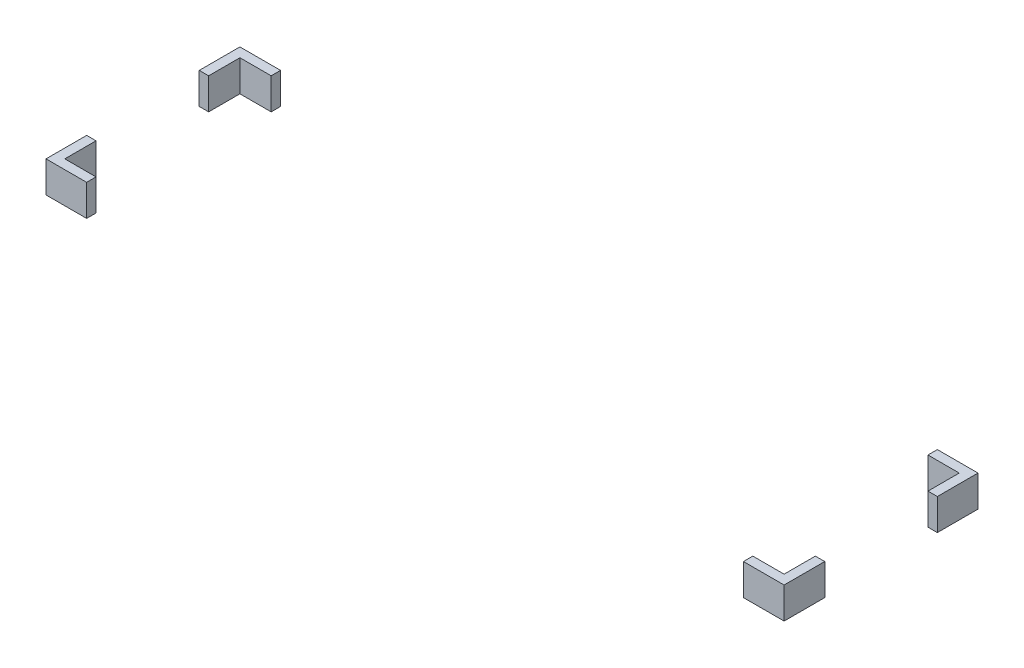
ISO-10303-21;
HEADER;
FILE_DESCRIPTION(('STEP AP214'),'2;1');
FILE_NAME('part.step','',(''),(''),'','','');
FILE_SCHEMA(('AUTOMOTIVE_DESIGN { 1 0 10303 214 1 1 1 1 }'));
ENDSEC;
DATA;
#1=APPLICATION_CONTEXT('core data for automotive mechanical design processes');
#2=APPLICATION_PROTOCOL_DEFINITION('international standard','automotive_design',2000,#1);
#3=PRODUCT_CONTEXT('',#1,'mechanical');
#4=PRODUCT('Part','Part','',(#3));
#5=PRODUCT_RELATED_PRODUCT_CATEGORY('part','',(#4));
#6=PRODUCT_DEFINITION_FORMATION('','',#4);
#7=PRODUCT_DEFINITION_CONTEXT('part definition',#1,'design');
#8=PRODUCT_DEFINITION('design','',#6,#7);
#9=PRODUCT_DEFINITION_SHAPE('','',#8);
#10=(LENGTH_UNIT() NAMED_UNIT(*) SI_UNIT(.MILLI.,.METRE.));
#11=(NAMED_UNIT(*) PLANE_ANGLE_UNIT() SI_UNIT($,.RADIAN.));
#12=(NAMED_UNIT(*) SI_UNIT($,.STERADIAN.) SOLID_ANGLE_UNIT());
#13=UNCERTAINTY_MEASURE_WITH_UNIT(LENGTH_MEASURE(1.E-05),#10,'distance_accuracy_value','');
#14=(GEOMETRIC_REPRESENTATION_CONTEXT(3) GLOBAL_UNCERTAINTY_ASSIGNED_CONTEXT((#13)) GLOBAL_UNIT_ASSIGNED_CONTEXT((#10,
#11,#12)) REPRESENTATION_CONTEXT('',''));
#15=CARTESIAN_POINT('',(0.,0.,0.));
#16=DIRECTION('',(0.,0.,1.));
#17=DIRECTION('',(1.,0.,0.));
#18=AXIS2_PLACEMENT_3D('',#15,#16,#17);
#19=CARTESIAN_POINT('',(0.,5.,14.));
#20=DIRECTION('',(0.,0.,1.));
#21=DIRECTION('',(1.,0.,0.));
#22=AXIS2_PLACEMENT_3D('',#19,#20,#21);
#23=PLANE('',#22);
#24=DIRECTION('',(-1.,0.,0.));
#25=VECTOR('',#24,1.);
#26=CARTESIAN_POINT('',(0.,0.,14.));
#27=LINE('',#26,#25);
#28=CARTESIAN_POINT('',(57.5,0.,14.));
#29=VERTEX_POINT('',#28);
#30=CARTESIAN_POINT('',(52.5,0.,14.));
#31=VERTEX_POINT('',#30);
#32=EDGE_CURVE('E128',#29,#31,#27,.T.);
#33=ORIENTED_EDGE('',*,*,#32,.T.);
#34=DIRECTION('',(0.,-1.,0.));
#35=VECTOR('',#34,1.);
#36=CARTESIAN_POINT('',(52.5,5.,14.));
#37=LINE('',#36,#35);
#38=CARTESIAN_POINT('',(52.5,5.,14.));
#39=VERTEX_POINT('',#38);
#40=EDGE_CURVE('E12',#39,#31,#37,.T.);
#41=ORIENTED_EDGE('',*,*,#40,.F.);
#42=DIRECTION('',(-1.,0.,0.));
#43=VECTOR('',#42,1.);
#44=CARTESIAN_POINT('',(0.,5.,14.));
#45=LINE('',#44,#43);
#46=CARTESIAN_POINT('',(57.5,5.,14.));
#47=VERTEX_POINT('',#46);
#48=EDGE_CURVE('E142',#47,#39,#45,.T.);
#49=ORIENTED_EDGE('',*,*,#48,.F.);
#50=DIRECTION('',(0.,-1.,0.));
#51=VECTOR('',#50,1.);
#52=CARTESIAN_POINT('',(57.5,5.,14.));
#53=LINE('',#52,#51);
#54=EDGE_CURVE('E60',#47,#29,#53,.T.);
#55=ORIENTED_EDGE('',*,*,#54,.T.);
#56=EDGE_LOOP('',(#33,#41,#49,#55));
#57=FACE_BOUND('',#56,.T.);
#58=ADVANCED_FACE('F44',(#57),#23,.F.);
#59=CARTESIAN_POINT('',(52.5,5.,0.));
#60=DIRECTION('',(1.,0.,0.));
#61=DIRECTION('',(0.,0.,-1.));
#62=AXIS2_PLACEMENT_3D('',#59,#60,#61);
#63=PLANE('',#62);
#64=DIRECTION('',(0.,0.,1.));
#65=VECTOR('',#64,1.);
#66=CARTESIAN_POINT('',(52.5,0.,0.));
#67=LINE('',#66,#65);
#68=CARTESIAN_POINT('',(52.5,0.,15.5));
#69=VERTEX_POINT('',#68);
#70=EDGE_CURVE('E130',#31,#69,#67,.T.);
#71=ORIENTED_EDGE('',*,*,#70,.T.);
#72=DIRECTION('',(0.,-1.,0.));
#73=VECTOR('',#72,1.);
#74=CARTESIAN_POINT('',(52.5,5.,15.5));
#75=LINE('',#74,#73);
#76=CARTESIAN_POINT('',(52.5,5.,15.5));
#77=VERTEX_POINT('',#76);
#78=EDGE_CURVE('E52',#77,#69,#75,.T.);
#79=ORIENTED_EDGE('',*,*,#78,.F.);
#80=DIRECTION('',(0.,0.,1.));
#81=VECTOR('',#80,1.);
#82=CARTESIAN_POINT('',(52.5,5.,0.));
#83=LINE('',#82,#81);
#84=EDGE_CURVE('E93',#39,#77,#83,.T.);
#85=ORIENTED_EDGE('',*,*,#84,.F.);
#86=ORIENTED_EDGE('',*,*,#40,.T.);
#87=EDGE_LOOP('',(#71,#79,#85,#86));
#88=FACE_BOUND('',#87,.T.);
#89=ADVANCED_FACE('F148',(#88),#63,.F.);
#90=CARTESIAN_POINT('',(0.,5.,15.5));
#91=DIRECTION('',(0.,0.,1.));
#92=DIRECTION('',(1.,0.,0.));
#93=AXIS2_PLACEMENT_3D('',#90,#91,#92);
#94=PLANE('',#93);
#95=DIRECTION('',(-1.,0.,0.));
#96=VECTOR('',#95,1.);
#97=CARTESIAN_POINT('',(0.,0.,15.5));
#98=LINE('',#97,#96);
#99=CARTESIAN_POINT('',(59.,0.,15.5));
#100=VERTEX_POINT('',#99);
#101=EDGE_CURVE('E133',#100,#69,#98,.T.);
#102=ORIENTED_EDGE('',*,*,#101,.F.);
#103=DIRECTION('',(0.,-1.,0.));
#104=VECTOR('',#103,1.);
#105=CARTESIAN_POINT('',(59.,5.,15.5));
#106=LINE('',#105,#104);
#107=CARTESIAN_POINT('',(59.,5.,15.5));
#108=VERTEX_POINT('',#107);
#109=EDGE_CURVE('E120',#108,#100,#106,.T.);
#110=ORIENTED_EDGE('',*,*,#109,.F.);
#111=DIRECTION('',(-1.,0.,0.));
#112=VECTOR('',#111,1.);
#113=CARTESIAN_POINT('',(0.,5.,15.5));
#114=LINE('',#113,#112);
#115=EDGE_CURVE('E110',#108,#77,#114,.T.);
#116=ORIENTED_EDGE('',*,*,#115,.T.);
#117=ORIENTED_EDGE('',*,*,#78,.T.);
#118=EDGE_LOOP('',(#102,#110,#116,#117));
#119=FACE_BOUND('',#118,.T.);
#120=ADVANCED_FACE('F147',(#119),#94,.T.);
#121=CARTESIAN_POINT('',(59.,5.,0.));
#122=DIRECTION('',(-1.,0.,0.));
#123=DIRECTION('',(0.,0.,1.));
#124=AXIS2_PLACEMENT_3D('',#121,#122,#123);
#125=PLANE('',#124);
#126=DIRECTION('',(0.,0.,-1.));
#127=VECTOR('',#126,1.);
#128=CARTESIAN_POINT('',(59.,0.,0.));
#129=LINE('',#128,#127);
#130=CARTESIAN_POINT('',(59.,0.,9.));
#131=VERTEX_POINT('',#130);
#132=EDGE_CURVE('E117',#100,#131,#129,.T.);
#133=ORIENTED_EDGE('',*,*,#132,.T.);
#134=DIRECTION('',(0.,-1.,0.));
#135=VECTOR('',#134,1.);
#136=CARTESIAN_POINT('',(59.,5.,9.));
#137=LINE('',#136,#135);
#138=CARTESIAN_POINT('',(59.,5.,9.));
#139=VERTEX_POINT('',#138);
#140=EDGE_CURVE('E114',#139,#131,#137,.T.);
#141=ORIENTED_EDGE('',*,*,#140,.F.);
#142=DIRECTION('',(0.,0.,-1.));
#143=VECTOR('',#142,1.);
#144=CARTESIAN_POINT('',(59.,5.,0.));
#145=LINE('',#144,#143);
#146=EDGE_CURVE('E103',#108,#139,#145,.T.);
#147=ORIENTED_EDGE('',*,*,#146,.F.);
#148=ORIENTED_EDGE('',*,*,#109,.T.);
#149=EDGE_LOOP('',(#133,#141,#147,#148));
#150=FACE_BOUND('',#149,.T.);
#151=ADVANCED_FACE('F115',(#150),#125,.F.);
#152=CARTESIAN_POINT('',(0.,5.,9.));
#153=DIRECTION('',(0.,0.,1.));
#154=DIRECTION('',(1.,0.,0.));
#155=AXIS2_PLACEMENT_3D('',#152,#153,#154);
#156=PLANE('',#155);
#157=DIRECTION('',(-1.,0.,0.));
#158=VECTOR('',#157,1.);
#159=CARTESIAN_POINT('',(0.,0.,9.));
#160=LINE('',#159,#158);
#161=CARTESIAN_POINT('',(57.5,0.,9.));
#162=VERTEX_POINT('',#161);
#163=EDGE_CURVE('E137',#131,#162,#160,.T.);
#164=ORIENTED_EDGE('',*,*,#163,.T.);
#165=DIRECTION('',(0.,-1.,0.));
#166=VECTOR('',#165,1.);
#167=CARTESIAN_POINT('',(57.5,5.,9.));
#168=LINE('',#167,#166);
#169=CARTESIAN_POINT('',(57.5,5.,9.));
#170=VERTEX_POINT('',#169);
#171=EDGE_CURVE('E81',#170,#162,#168,.T.);
#172=ORIENTED_EDGE('',*,*,#171,.F.);
#173=DIRECTION('',(-1.,0.,0.));
#174=VECTOR('',#173,1.);
#175=CARTESIAN_POINT('',(0.,5.,9.));
#176=LINE('',#175,#174);
#177=EDGE_CURVE('E108',#139,#170,#176,.T.);
#178=ORIENTED_EDGE('',*,*,#177,.F.);
#179=ORIENTED_EDGE('',*,*,#140,.T.);
#180=EDGE_LOOP('',(#164,#172,#178,#179));
#181=FACE_BOUND('',#180,.T.);
#182=ADVANCED_FACE('F122',(#181),#156,.F.);
#183=CARTESIAN_POINT('',(57.5,5.,0.));
#184=DIRECTION('',(-1.,0.,0.));
#185=DIRECTION('',(0.,0.,1.));
#186=AXIS2_PLACEMENT_3D('',#183,#184,#185);
#187=PLANE('',#186);
#188=DIRECTION('',(0.,0.,-1.));
#189=VECTOR('',#188,1.);
#190=CARTESIAN_POINT('',(57.5,0.,0.));
#191=LINE('',#190,#189);
#192=EDGE_CURVE('E139',#29,#162,#191,.T.);
#193=ORIENTED_EDGE('',*,*,#192,.F.);
#194=ORIENTED_EDGE('',*,*,#54,.F.);
#195=DIRECTION('',(0.,0.,-1.));
#196=VECTOR('',#195,1.);
#197=CARTESIAN_POINT('',(57.5,5.,0.));
#198=LINE('',#197,#196);
#199=EDGE_CURVE('E123',#47,#170,#198,.T.);
#200=ORIENTED_EDGE('',*,*,#199,.T.);
#201=ORIENTED_EDGE('',*,*,#171,.T.);
#202=EDGE_LOOP('',(#193,#194,#200,#201));
#203=FACE_BOUND('',#202,.T.);
#204=ADVANCED_FACE('F152',(#203),#187,.T.);
#205=CARTESIAN_POINT('',(0.,5.,0.));
#206=DIRECTION('',(0.,1.,0.));
#207=DIRECTION('',(0.,0.,1.));
#208=AXIS2_PLACEMENT_3D('',#205,#206,#207);
#209=PLANE('',#208);
#210=ORIENTED_EDGE('',*,*,#48,.T.);
#211=ORIENTED_EDGE('',*,*,#84,.T.);
#212=ORIENTED_EDGE('',*,*,#115,.F.);
#213=ORIENTED_EDGE('',*,*,#146,.T.);
#214=ORIENTED_EDGE('',*,*,#177,.T.);
#215=ORIENTED_EDGE('',*,*,#199,.F.);
#216=EDGE_LOOP('',(#210,#211,#212,#213,#214,#215));
#217=FACE_BOUND('',#216,.T.);
#218=ADVANCED_FACE('F105',(#217),#209,.T.);
#219=CARTESIAN_POINT('',(0.,0.,0.));
#220=DIRECTION('',(0.,1.,0.));
#221=DIRECTION('',(0.,0.,1.));
#222=AXIS2_PLACEMENT_3D('',#219,#220,#221);
#223=PLANE('',#222);
#224=ORIENTED_EDGE('',*,*,#32,.F.);
#225=ORIENTED_EDGE('',*,*,#192,.T.);
#226=ORIENTED_EDGE('',*,*,#163,.F.);
#227=ORIENTED_EDGE('',*,*,#132,.F.);
#228=ORIENTED_EDGE('',*,*,#101,.T.);
#229=ORIENTED_EDGE('',*,*,#70,.F.);
#230=EDGE_LOOP('',(#224,#225,#226,#227,#228,#229));
#231=FACE_BOUND('',#230,.T.);
#232=ADVANCED_FACE('F151',(#231),#223,.F.);
#233=CLOSED_SHELL('',(#58,#89,#120,#151,#182,#204,#218,#232));
#234=MANIFOLD_SOLID_BREP('B2',#233);
#235=CARTESIAN_POINT('',(57.5,5.,0.));
#236=DIRECTION('',(1.,0.,0.));
#237=DIRECTION('',(0.,0.,-1.));
#238=AXIS2_PLACEMENT_3D('',#235,#236,#237);
#239=PLANE('',#238);
#240=DIRECTION('',(0.,0.,1.));
#241=VECTOR('',#240,1.);
#242=CARTESIAN_POINT('',(57.5,0.,0.));
#243=LINE('',#242,#241);
#244=CARTESIAN_POINT('',(57.5,0.,-14.));
#245=VERTEX_POINT('',#244);
#246=CARTESIAN_POINT('',(57.5,0.,-9.));
#247=VERTEX_POINT('',#246);
#248=EDGE_CURVE('E314',#245,#247,#243,.T.);
#249=ORIENTED_EDGE('',*,*,#248,.T.);
#250=DIRECTION('',(0.,-1.,0.));
#251=VECTOR('',#250,1.);
#252=CARTESIAN_POINT('',(57.5,5.,-9.));
#253=LINE('',#252,#251);
#254=CARTESIAN_POINT('',(57.5,5.,-9.));
#255=VERTEX_POINT('',#254);
#256=EDGE_CURVE('E42',#255,#247,#253,.T.);
#257=ORIENTED_EDGE('',*,*,#256,.F.);
#258=DIRECTION('',(0.,0.,1.));
#259=VECTOR('',#258,1.);
#260=CARTESIAN_POINT('',(57.5,5.,0.));
#261=LINE('',#260,#259);
#262=CARTESIAN_POINT('',(57.5,5.,-14.));
#263=VERTEX_POINT('',#262);
#264=EDGE_CURVE('E328',#263,#255,#261,.T.);
#265=ORIENTED_EDGE('',*,*,#264,.F.);
#266=DIRECTION('',(0.,-1.,0.));
#267=VECTOR('',#266,1.);
#268=CARTESIAN_POINT('',(57.5,5.,-14.));
#269=LINE('',#268,#267);
#270=EDGE_CURVE('E246',#263,#245,#269,.T.);
#271=ORIENTED_EDGE('',*,*,#270,.T.);
#272=EDGE_LOOP('',(#249,#257,#265,#271));
#273=FACE_BOUND('',#272,.T.);
#274=ADVANCED_FACE('F230',(#273),#239,.F.);
#275=CARTESIAN_POINT('',(0.,5.,-9.));
#276=DIRECTION('',(0.,0.,-1.));
#277=DIRECTION('',(-1.,0.,0.));
#278=AXIS2_PLACEMENT_3D('',#275,#276,#277);
#279=PLANE('',#278);
#280=DIRECTION('',(1.,0.,0.));
#281=VECTOR('',#280,1.);
#282=CARTESIAN_POINT('',(0.,0.,-9.));
#283=LINE('',#282,#281);
#284=CARTESIAN_POINT('',(59.,0.,-9.));
#285=VERTEX_POINT('',#284);
#286=EDGE_CURVE('E316',#247,#285,#283,.T.);
#287=ORIENTED_EDGE('',*,*,#286,.T.);
#288=DIRECTION('',(0.,-1.,0.));
#289=VECTOR('',#288,1.);
#290=CARTESIAN_POINT('',(59.,5.,-9.));
#291=LINE('',#290,#289);
#292=CARTESIAN_POINT('',(59.,5.,-9.));
#293=VERTEX_POINT('',#292);
#294=EDGE_CURVE('E238',#293,#285,#291,.T.);
#295=ORIENTED_EDGE('',*,*,#294,.F.);
#296=DIRECTION('',(1.,0.,0.));
#297=VECTOR('',#296,1.);
#298=CARTESIAN_POINT('',(0.,5.,-9.));
#299=LINE('',#298,#297);
#300=EDGE_CURVE('E279',#255,#293,#299,.T.);
#301=ORIENTED_EDGE('',*,*,#300,.F.);
#302=ORIENTED_EDGE('',*,*,#256,.T.);
#303=EDGE_LOOP('',(#287,#295,#301,#302));
#304=FACE_BOUND('',#303,.T.);
#305=ADVANCED_FACE('F334',(#304),#279,.F.);
#306=CARTESIAN_POINT('',(59.,5.,0.));
#307=DIRECTION('',(1.,0.,0.));
#308=DIRECTION('',(0.,0.,-1.));
#309=AXIS2_PLACEMENT_3D('',#306,#307,#308);
#310=PLANE('',#309);
#311=DIRECTION('',(0.,0.,1.));
#312=VECTOR('',#311,1.);
#313=CARTESIAN_POINT('',(59.,0.,0.));
#314=LINE('',#313,#312);
#315=CARTESIAN_POINT('',(59.,0.,-15.5));
#316=VERTEX_POINT('',#315);
#317=EDGE_CURVE('E319',#316,#285,#314,.T.);
#318=ORIENTED_EDGE('',*,*,#317,.F.);
#319=DIRECTION('',(0.,-1.,0.));
#320=VECTOR('',#319,1.);
#321=CARTESIAN_POINT('',(59.,5.,-15.5));
#322=LINE('',#321,#320);
#323=CARTESIAN_POINT('',(59.,5.,-15.5));
#324=VERTEX_POINT('',#323);
#325=EDGE_CURVE('E306',#324,#316,#322,.T.);
#326=ORIENTED_EDGE('',*,*,#325,.F.);
#327=DIRECTION('',(0.,0.,1.));
#328=VECTOR('',#327,1.);
#329=CARTESIAN_POINT('',(59.,5.,0.));
#330=LINE('',#329,#328);
#331=EDGE_CURVE('E296',#324,#293,#330,.T.);
#332=ORIENTED_EDGE('',*,*,#331,.T.);
#333=ORIENTED_EDGE('',*,*,#294,.T.);
#334=EDGE_LOOP('',(#318,#326,#332,#333));
#335=FACE_BOUND('',#334,.T.);
#336=ADVANCED_FACE('F333',(#335),#310,.T.);
#337=CARTESIAN_POINT('',(0.,5.,-15.5));
#338=DIRECTION('',(0.,0.,1.));
#339=DIRECTION('',(1.,0.,0.));
#340=AXIS2_PLACEMENT_3D('',#337,#338,#339);
#341=PLANE('',#340);
#342=DIRECTION('',(-1.,0.,0.));
#343=VECTOR('',#342,1.);
#344=CARTESIAN_POINT('',(0.,0.,-15.5));
#345=LINE('',#344,#343);
#346=CARTESIAN_POINT('',(52.5,0.,-15.5));
#347=VERTEX_POINT('',#346);
#348=EDGE_CURVE('E303',#316,#347,#345,.T.);
#349=ORIENTED_EDGE('',*,*,#348,.T.);
#350=DIRECTION('',(0.,-1.,0.));
#351=VECTOR('',#350,1.);
#352=CARTESIAN_POINT('',(52.5,5.,-15.5));
#353=LINE('',#352,#351);
#354=CARTESIAN_POINT('',(52.5,5.,-15.5));
#355=VERTEX_POINT('',#354);
#356=EDGE_CURVE('E300',#355,#347,#353,.T.);
#357=ORIENTED_EDGE('',*,*,#356,.F.);
#358=DIRECTION('',(-1.,0.,0.));
#359=VECTOR('',#358,1.);
#360=CARTESIAN_POINT('',(0.,5.,-15.5));
#361=LINE('',#360,#359);
#362=EDGE_CURVE('E289',#324,#355,#361,.T.);
#363=ORIENTED_EDGE('',*,*,#362,.F.);
#364=ORIENTED_EDGE('',*,*,#325,.T.);
#365=EDGE_LOOP('',(#349,#357,#363,#364));
#366=FACE_BOUND('',#365,.T.);
#367=ADVANCED_FACE('F301',(#366),#341,.F.);
#368=CARTESIAN_POINT('',(52.5,5.,0.));
#369=DIRECTION('',(1.,0.,0.));
#370=DIRECTION('',(0.,0.,-1.));
#371=AXIS2_PLACEMENT_3D('',#368,#369,#370);
#372=PLANE('',#371);
#373=DIRECTION('',(0.,0.,1.));
#374=VECTOR('',#373,1.);
#375=CARTESIAN_POINT('',(52.5,0.,0.));
#376=LINE('',#375,#374);
#377=CARTESIAN_POINT('',(52.5,0.,-14.));
#378=VERTEX_POINT('',#377);
#379=EDGE_CURVE('E323',#347,#378,#376,.T.);
#380=ORIENTED_EDGE('',*,*,#379,.T.);
#381=DIRECTION('',(0.,-1.,0.));
#382=VECTOR('',#381,1.);
#383=CARTESIAN_POINT('',(52.5,5.,-14.));
#384=LINE('',#383,#382);
#385=CARTESIAN_POINT('',(52.5,5.,-14.));
#386=VERTEX_POINT('',#385);
#387=EDGE_CURVE('E267',#386,#378,#384,.T.);
#388=ORIENTED_EDGE('',*,*,#387,.F.);
#389=DIRECTION('',(0.,0.,1.));
#390=VECTOR('',#389,1.);
#391=CARTESIAN_POINT('',(52.5,5.,0.));
#392=LINE('',#391,#390);
#393=EDGE_CURVE('E294',#355,#386,#392,.T.);
#394=ORIENTED_EDGE('',*,*,#393,.F.);
#395=ORIENTED_EDGE('',*,*,#356,.T.);
#396=EDGE_LOOP('',(#380,#388,#394,#395));
#397=FACE_BOUND('',#396,.T.);
#398=ADVANCED_FACE('F308',(#397),#372,.F.);
#399=CARTESIAN_POINT('',(0.,5.,-14.));
#400=DIRECTION('',(0.,0.,1.));
#401=DIRECTION('',(1.,0.,0.));
#402=AXIS2_PLACEMENT_3D('',#399,#400,#401);
#403=PLANE('',#402);
#404=DIRECTION('',(-1.,0.,0.));
#405=VECTOR('',#404,1.);
#406=CARTESIAN_POINT('',(0.,0.,-14.));
#407=LINE('',#406,#405);
#408=EDGE_CURVE('E325',#245,#378,#407,.T.);
#409=ORIENTED_EDGE('',*,*,#408,.F.);
#410=ORIENTED_EDGE('',*,*,#270,.F.);
#411=DIRECTION('',(-1.,0.,0.));
#412=VECTOR('',#411,1.);
#413=CARTESIAN_POINT('',(0.,5.,-14.));
#414=LINE('',#413,#412);
#415=EDGE_CURVE('E309',#263,#386,#414,.T.);
#416=ORIENTED_EDGE('',*,*,#415,.T.);
#417=ORIENTED_EDGE('',*,*,#387,.T.);
#418=EDGE_LOOP('',(#409,#410,#416,#417));
#419=FACE_BOUND('',#418,.T.);
#420=ADVANCED_FACE('F338',(#419),#403,.T.);
#421=CARTESIAN_POINT('',(0.,5.,0.));
#422=DIRECTION('',(0.,1.,0.));
#423=DIRECTION('',(0.,0.,1.));
#424=AXIS2_PLACEMENT_3D('',#421,#422,#423);
#425=PLANE('',#424);
#426=ORIENTED_EDGE('',*,*,#264,.T.);
#427=ORIENTED_EDGE('',*,*,#300,.T.);
#428=ORIENTED_EDGE('',*,*,#331,.F.);
#429=ORIENTED_EDGE('',*,*,#362,.T.);
#430=ORIENTED_EDGE('',*,*,#393,.T.);
#431=ORIENTED_EDGE('',*,*,#415,.F.);
#432=EDGE_LOOP('',(#426,#427,#428,#429,#430,#431));
#433=FACE_BOUND('',#432,.T.);
#434=ADVANCED_FACE('F291',(#433),#425,.T.);
#435=CARTESIAN_POINT('',(0.,0.,0.));
#436=DIRECTION('',(0.,1.,0.));
#437=DIRECTION('',(0.,0.,1.));
#438=AXIS2_PLACEMENT_3D('',#435,#436,#437);
#439=PLANE('',#438);
#440=ORIENTED_EDGE('',*,*,#248,.F.);
#441=ORIENTED_EDGE('',*,*,#408,.T.);
#442=ORIENTED_EDGE('',*,*,#379,.F.);
#443=ORIENTED_EDGE('',*,*,#348,.F.);
#444=ORIENTED_EDGE('',*,*,#317,.T.);
#445=ORIENTED_EDGE('',*,*,#286,.F.);
#446=EDGE_LOOP('',(#440,#441,#442,#443,#444,#445));
#447=FACE_BOUND('',#446,.T.);
#448=ADVANCED_FACE('F337',(#447),#439,.F.);
#449=CLOSED_SHELL('',(#274,#305,#336,#367,#398,#420,#434,#448));
#450=MANIFOLD_SOLID_BREP('B6',#449);
#451=CARTESIAN_POINT('',(-52.5,5.,0.));
#452=DIRECTION('',(1.,0.,0.));
#453=DIRECTION('',(0.,0.,-1.));
#454=AXIS2_PLACEMENT_3D('',#451,#452,#453);
#455=PLANE('',#454);
#456=DIRECTION('',(0.,0.,1.));
#457=VECTOR('',#456,1.);
#458=CARTESIAN_POINT('',(-52.5,0.,0.));
#459=LINE('',#458,#457);
#460=CARTESIAN_POINT('',(-52.5,0.,14.));
#461=VERTEX_POINT('',#460);
#462=CARTESIAN_POINT('',(-52.5,0.,15.5));
#463=VERTEX_POINT('',#462);
#464=EDGE_CURVE('E496',#461,#463,#459,.T.);
#465=ORIENTED_EDGE('',*,*,#464,.F.);
#466=DIRECTION('',(0.,-1.,0.));
#467=VECTOR('',#466,1.);
#468=CARTESIAN_POINT('',(-52.5,5.,14.));
#469=LINE('',#468,#467);
#470=CARTESIAN_POINT('',(-52.5,5.,14.));
#471=VERTEX_POINT('',#470);
#472=EDGE_CURVE('E228',#471,#461,#469,.T.);
#473=ORIENTED_EDGE('',*,*,#472,.F.);
#474=DIRECTION('',(0.,0.,1.));
#475=VECTOR('',#474,1.);
#476=CARTESIAN_POINT('',(-52.5,5.,0.));
#477=LINE('',#476,#475);
#478=CARTESIAN_POINT('',(-52.5,5.,15.5));
#479=VERTEX_POINT('',#478);
#480=EDGE_CURVE('E510',#471,#479,#477,.T.);
#481=ORIENTED_EDGE('',*,*,#480,.T.);
#482=DIRECTION('',(0.,-1.,0.));
#483=VECTOR('',#482,1.);
#484=CARTESIAN_POINT('',(-52.5,5.,15.5));
#485=LINE('',#484,#483);
#486=EDGE_CURVE('E459',#479,#463,#485,.T.);
#487=ORIENTED_EDGE('',*,*,#486,.T.);
#488=EDGE_LOOP('',(#465,#473,#481,#487));
#489=FACE_BOUND('',#488,.T.);
#490=ADVANCED_FACE('F415',(#489),#455,.T.);
#491=CARTESIAN_POINT('',(0.,5.,14.));
#492=DIRECTION('',(0.,0.,-1.));
#493=DIRECTION('',(-1.,0.,0.));
#494=AXIS2_PLACEMENT_3D('',#491,#492,#493);
#495=PLANE('',#494);
#496=DIRECTION('',(1.,0.,0.));
#497=VECTOR('',#496,1.);
#498=CARTESIAN_POINT('',(0.,0.,14.));
#499=LINE('',#498,#497);
#500=CARTESIAN_POINT('',(-57.5,0.,14.));
#501=VERTEX_POINT('',#500);
#502=EDGE_CURVE('E499',#501,#461,#499,.T.);
#503=ORIENTED_EDGE('',*,*,#502,.F.);
#504=DIRECTION('',(0.,-1.,0.));
#505=VECTOR('',#504,1.);
#506=CARTESIAN_POINT('',(-57.5,5.,14.));
#507=LINE('',#506,#505);
#508=CARTESIAN_POINT('',(-57.5,5.,14.));
#509=VERTEX_POINT('',#508);
#510=EDGE_CURVE('E423',#509,#501,#507,.T.);
#511=ORIENTED_EDGE('',*,*,#510,.F.);
#512=DIRECTION('',(1.,0.,0.));
#513=VECTOR('',#512,1.);
#514=CARTESIAN_POINT('',(0.,5.,14.));
#515=LINE('',#514,#513);
#516=EDGE_CURVE('E522',#509,#471,#515,.T.);
#517=ORIENTED_EDGE('',*,*,#516,.T.);
#518=ORIENTED_EDGE('',*,*,#472,.T.);
#519=EDGE_LOOP('',(#503,#511,#517,#518));
#520=FACE_BOUND('',#519,.T.);
#521=ADVANCED_FACE('F521',(#520),#495,.T.);
#522=CARTESIAN_POINT('',(-57.5,5.,0.));
#523=DIRECTION('',(-1.,0.,0.));
#524=DIRECTION('',(0.,0.,1.));
#525=AXIS2_PLACEMENT_3D('',#522,#523,#524);
#526=PLANE('',#525);
#527=DIRECTION('',(0.,0.,-1.));
#528=VECTOR('',#527,1.);
#529=CARTESIAN_POINT('',(-57.5,0.,0.));
#530=LINE('',#529,#528);
#531=CARTESIAN_POINT('',(-57.5,0.,9.));
#532=VERTEX_POINT('',#531);
#533=EDGE_CURVE('E502',#501,#532,#530,.T.);
#534=ORIENTED_EDGE('',*,*,#533,.T.);
#535=DIRECTION('',(0.,-1.,0.));
#536=VECTOR('',#535,1.);
#537=CARTESIAN_POINT('',(-57.5,5.,9.));
#538=LINE('',#537,#536);
#539=CARTESIAN_POINT('',(-57.5,5.,9.));
#540=VERTEX_POINT('',#539);
#541=EDGE_CURVE('E482',#540,#532,#538,.T.);
#542=ORIENTED_EDGE('',*,*,#541,.F.);
#543=DIRECTION('',(0.,0.,-1.));
#544=VECTOR('',#543,1.);
#545=CARTESIAN_POINT('',(-57.5,5.,0.));
#546=LINE('',#545,#544);
#547=EDGE_CURVE('E488',#509,#540,#546,.T.);
#548=ORIENTED_EDGE('',*,*,#547,.F.);
#549=ORIENTED_EDGE('',*,*,#510,.T.);
#550=EDGE_LOOP('',(#534,#542,#548,#549));
#551=FACE_BOUND('',#550,.T.);
#552=ADVANCED_FACE('F515',(#551),#526,.F.);
#553=CARTESIAN_POINT('',(0.,5.,9.));
#554=DIRECTION('',(0.,0.,-1.));
#555=DIRECTION('',(-1.,0.,0.));
#556=AXIS2_PLACEMENT_3D('',#553,#554,#555);
#557=PLANE('',#556);
#558=DIRECTION('',(1.,0.,0.));
#559=VECTOR('',#558,1.);
#560=CARTESIAN_POINT('',(0.,0.,9.));
#561=LINE('',#560,#559);
#562=CARTESIAN_POINT('',(-59.,0.,9.));
#563=VERTEX_POINT('',#562);
#564=EDGE_CURVE('E477',#563,#532,#561,.T.);
#565=ORIENTED_EDGE('',*,*,#564,.F.);
#566=DIRECTION('',(0.,-1.,0.));
#567=VECTOR('',#566,1.);
#568=CARTESIAN_POINT('',(-59.,5.,9.));
#569=LINE('',#568,#567);
#570=CARTESIAN_POINT('',(-59.,5.,9.));
#571=VERTEX_POINT('',#570);
#572=EDGE_CURVE('E472',#571,#563,#569,.T.);
#573=ORIENTED_EDGE('',*,*,#572,.F.);
#574=DIRECTION('',(1.,0.,0.));
#575=VECTOR('',#574,1.);
#576=CARTESIAN_POINT('',(0.,5.,9.));
#577=LINE('',#576,#575);
#578=EDGE_CURVE('E475',#571,#540,#577,.T.);
#579=ORIENTED_EDGE('',*,*,#578,.T.);
#580=ORIENTED_EDGE('',*,*,#541,.T.);
#581=EDGE_LOOP('',(#565,#573,#579,#580));
#582=FACE_BOUND('',#581,.T.);
#583=ADVANCED_FACE('F474',(#582),#557,.T.);
#584=CARTESIAN_POINT('',(-59.,5.,0.));
#585=DIRECTION('',(-1.,0.,0.));
#586=DIRECTION('',(0.,0.,1.));
#587=AXIS2_PLACEMENT_3D('',#584,#585,#586);
#588=PLANE('',#587);
#589=DIRECTION('',(0.,0.,-1.));
#590=VECTOR('',#589,1.);
#591=CARTESIAN_POINT('',(-59.,0.,0.));
#592=LINE('',#591,#590);
#593=CARTESIAN_POINT('',(-59.,0.,15.5));
#594=VERTEX_POINT('',#593);
#595=EDGE_CURVE('E506',#594,#563,#592,.T.);
#596=ORIENTED_EDGE('',*,*,#595,.F.);
#597=DIRECTION('',(0.,-1.,0.));
#598=VECTOR('',#597,1.);
#599=CARTESIAN_POINT('',(-59.,5.,15.5));
#600=LINE('',#599,#598);
#601=CARTESIAN_POINT('',(-59.,5.,15.5));
#602=VERTEX_POINT('',#601);
#603=EDGE_CURVE('E452',#602,#594,#600,.T.);
#604=ORIENTED_EDGE('',*,*,#603,.F.);
#605=DIRECTION('',(0.,0.,-1.));
#606=VECTOR('',#605,1.);
#607=CARTESIAN_POINT('',(-59.,5.,0.));
#608=LINE('',#607,#606);
#609=EDGE_CURVE('E485',#602,#571,#608,.T.);
#610=ORIENTED_EDGE('',*,*,#609,.T.);
#611=ORIENTED_EDGE('',*,*,#572,.T.);
#612=EDGE_LOOP('',(#596,#604,#610,#611));
#613=FACE_BOUND('',#612,.T.);
#614=ADVANCED_FACE('F491',(#613),#588,.T.);
#615=CARTESIAN_POINT('',(0.,5.,15.5));
#616=DIRECTION('',(0.,0.,-1.));
#617=DIRECTION('',(-1.,0.,0.));
#618=AXIS2_PLACEMENT_3D('',#615,#616,#617);
#619=PLANE('',#618);
#620=DIRECTION('',(1.,0.,0.));
#621=VECTOR('',#620,1.);
#622=CARTESIAN_POINT('',(0.,0.,15.5));
#623=LINE('',#622,#621);
#624=EDGE_CURVE('E508',#594,#463,#623,.T.);
#625=ORIENTED_EDGE('',*,*,#624,.T.);
#626=ORIENTED_EDGE('',*,*,#486,.F.);
#627=DIRECTION('',(1.,0.,0.));
#628=VECTOR('',#627,1.);
#629=CARTESIAN_POINT('',(0.,5.,15.5));
#630=LINE('',#629,#628);
#631=EDGE_CURVE('E431',#602,#479,#630,.T.);
#632=ORIENTED_EDGE('',*,*,#631,.F.);
#633=ORIENTED_EDGE('',*,*,#603,.T.);
#634=EDGE_LOOP('',(#625,#626,#632,#633));
#635=FACE_BOUND('',#634,.T.);
#636=ADVANCED_FACE('F523',(#635),#619,.F.);
#637=CARTESIAN_POINT('',(0.,5.,0.));
#638=DIRECTION('',(0.,1.,0.));
#639=DIRECTION('',(0.,0.,1.));
#640=AXIS2_PLACEMENT_3D('',#637,#638,#639);
#641=PLANE('',#640);
#642=ORIENTED_EDGE('',*,*,#480,.F.);
#643=ORIENTED_EDGE('',*,*,#516,.F.);
#644=ORIENTED_EDGE('',*,*,#547,.T.);
#645=ORIENTED_EDGE('',*,*,#578,.F.);
#646=ORIENTED_EDGE('',*,*,#609,.F.);
#647=ORIENTED_EDGE('',*,*,#631,.T.);
#648=EDGE_LOOP('',(#642,#643,#644,#645,#646,#647));
#649=FACE_BOUND('',#648,.T.);
#650=ADVANCED_FACE('F484',(#649),#641,.T.);
#651=CARTESIAN_POINT('',(0.,0.,0.));
#652=DIRECTION('',(0.,1.,0.));
#653=DIRECTION('',(0.,0.,1.));
#654=AXIS2_PLACEMENT_3D('',#651,#652,#653);
#655=PLANE('',#654);
#656=ORIENTED_EDGE('',*,*,#464,.T.);
#657=ORIENTED_EDGE('',*,*,#624,.F.);
#658=ORIENTED_EDGE('',*,*,#595,.T.);
#659=ORIENTED_EDGE('',*,*,#564,.T.);
#660=ORIENTED_EDGE('',*,*,#533,.F.);
#661=ORIENTED_EDGE('',*,*,#502,.T.);
#662=EDGE_LOOP('',(#656,#657,#658,#659,#660,#661));
#663=FACE_BOUND('',#662,.T.);
#664=ADVANCED_FACE('F520',(#663),#655,.F.);
#665=CLOSED_SHELL('',(#490,#521,#552,#583,#614,#636,#650,#664));
#666=MANIFOLD_SOLID_BREP('B36',#665);
#667=CARTESIAN_POINT('',(-59.,5.,0.));
#668=DIRECTION('',(1.,0.,0.));
#669=DIRECTION('',(0.,0.,-1.));
#670=AXIS2_PLACEMENT_3D('',#667,#668,#669);
#671=PLANE('',#670);
#672=DIRECTION('',(0.,0.,1.));
#673=VECTOR('',#672,1.);
#674=CARTESIAN_POINT('',(-59.,0.,0.));
#675=LINE('',#674,#673);
#676=CARTESIAN_POINT('',(-59.,0.,-15.5));
#677=VERTEX_POINT('',#676);
#678=CARTESIAN_POINT('',(-59.,0.,-9.));
#679=VERTEX_POINT('',#678);
#680=EDGE_CURVE('E675',#677,#679,#675,.T.);
#681=ORIENTED_EDGE('',*,*,#680,.T.);
#682=DIRECTION('',(0.,-1.,0.));
#683=VECTOR('',#682,1.);
#684=CARTESIAN_POINT('',(-59.,5.,-9.));
#685=LINE('',#684,#683);
#686=CARTESIAN_POINT('',(-59.,5.,-9.));
#687=VERTEX_POINT('',#686);
#688=EDGE_CURVE('E413',#687,#679,#685,.T.);
#689=ORIENTED_EDGE('',*,*,#688,.F.);
#690=DIRECTION('',(0.,0.,1.));
#691=VECTOR('',#690,1.);
#692=CARTESIAN_POINT('',(-59.,5.,0.));
#693=LINE('',#692,#691);
#694=CARTESIAN_POINT('',(-59.,5.,-15.5));
#695=VERTEX_POINT('',#694);
#696=EDGE_CURVE('E689',#695,#687,#693,.T.);
#697=ORIENTED_EDGE('',*,*,#696,.F.);
#698=DIRECTION('',(0.,-1.,0.));
#699=VECTOR('',#698,1.);
#700=CARTESIAN_POINT('',(-59.,5.,-15.5));
#701=LINE('',#700,#699);
#702=EDGE_CURVE('E607',#695,#677,#701,.T.);
#703=ORIENTED_EDGE('',*,*,#702,.T.);
#704=EDGE_LOOP('',(#681,#689,#697,#703));
#705=FACE_BOUND('',#704,.T.);
#706=ADVANCED_FACE('F591',(#705),#671,.F.);
#707=CARTESIAN_POINT('',(0.,5.,-9.));
#708=DIRECTION('',(0.,0.,-1.));
#709=DIRECTION('',(-1.,0.,0.));
#710=AXIS2_PLACEMENT_3D('',#707,#708,#709);
#711=PLANE('',#710);
#712=DIRECTION('',(1.,0.,0.));
#713=VECTOR('',#712,1.);
#714=CARTESIAN_POINT('',(0.,0.,-9.));
#715=LINE('',#714,#713);
#716=CARTESIAN_POINT('',(-57.5,0.,-9.));
#717=VERTEX_POINT('',#716);
#718=EDGE_CURVE('E677',#679,#717,#715,.T.);
#719=ORIENTED_EDGE('',*,*,#718,.T.);
#720=DIRECTION('',(0.,-1.,0.));
#721=VECTOR('',#720,1.);
#722=CARTESIAN_POINT('',(-57.5,5.,-9.));
#723=LINE('',#722,#721);
#724=CARTESIAN_POINT('',(-57.5,5.,-9.));
#725=VERTEX_POINT('',#724);
#726=EDGE_CURVE('E599',#725,#717,#723,.T.);
#727=ORIENTED_EDGE('',*,*,#726,.F.);
#728=DIRECTION('',(1.,0.,0.));
#729=VECTOR('',#728,1.);
#730=CARTESIAN_POINT('',(0.,5.,-9.));
#731=LINE('',#730,#729);
#732=EDGE_CURVE('E639',#687,#725,#731,.T.);
#733=ORIENTED_EDGE('',*,*,#732,.F.);
#734=ORIENTED_EDGE('',*,*,#688,.T.);
#735=EDGE_LOOP('',(#719,#727,#733,#734));
#736=FACE_BOUND('',#735,.T.);
#737=ADVANCED_FACE('F695',(#736),#711,.F.);
#738=CARTESIAN_POINT('',(-57.5,5.,0.));
#739=DIRECTION('',(1.,0.,0.));
#740=DIRECTION('',(0.,0.,-1.));
#741=AXIS2_PLACEMENT_3D('',#738,#739,#740);
#742=PLANE('',#741);
#743=DIRECTION('',(0.,0.,1.));
#744=VECTOR('',#743,1.);
#745=CARTESIAN_POINT('',(-57.5,0.,0.));
#746=LINE('',#745,#744);
#747=CARTESIAN_POINT('',(-57.5,0.,-14.));
#748=VERTEX_POINT('',#747);
#749=EDGE_CURVE('E680',#748,#717,#746,.T.);
#750=ORIENTED_EDGE('',*,*,#749,.F.);
#751=DIRECTION('',(0.,-1.,0.));
#752=VECTOR('',#751,1.);
#753=CARTESIAN_POINT('',(-57.5,5.,-14.));
#754=LINE('',#753,#752);
#755=CARTESIAN_POINT('',(-57.5,5.,-14.));
#756=VERTEX_POINT('',#755);
#757=EDGE_CURVE('E667',#756,#748,#754,.T.);
#758=ORIENTED_EDGE('',*,*,#757,.F.);
#759=DIRECTION('',(0.,0.,1.));
#760=VECTOR('',#759,1.);
#761=CARTESIAN_POINT('',(-57.5,5.,0.));
#762=LINE('',#761,#760);
#763=EDGE_CURVE('E657',#756,#725,#762,.T.);
#764=ORIENTED_EDGE('',*,*,#763,.T.);
#765=ORIENTED_EDGE('',*,*,#726,.T.);
#766=EDGE_LOOP('',(#750,#758,#764,#765));
#767=FACE_BOUND('',#766,.T.);
#768=ADVANCED_FACE('F694',(#767),#742,.T.);
#769=CARTESIAN_POINT('',(0.,5.,-14.));
#770=DIRECTION('',(0.,0.,-1.));
#771=DIRECTION('',(-1.,0.,0.));
#772=AXIS2_PLACEMENT_3D('',#769,#770,#771);
#773=PLANE('',#772);
#774=DIRECTION('',(1.,0.,0.));
#775=VECTOR('',#774,1.);
#776=CARTESIAN_POINT('',(0.,0.,-14.));
#777=LINE('',#776,#775);
#778=CARTESIAN_POINT('',(-52.5,0.,-14.));
#779=VERTEX_POINT('',#778);
#780=EDGE_CURVE('E664',#748,#779,#777,.T.);
#781=ORIENTED_EDGE('',*,*,#780,.T.);
#782=DIRECTION('',(0.,-1.,0.));
#783=VECTOR('',#782,1.);
#784=CARTESIAN_POINT('',(-52.5,5.,-14.));
#785=LINE('',#784,#783);
#786=CARTESIAN_POINT('',(-52.5,5.,-14.));
#787=VERTEX_POINT('',#786);
#788=EDGE_CURVE('E661',#787,#779,#785,.T.);
#789=ORIENTED_EDGE('',*,*,#788,.F.);
#790=DIRECTION('',(1.,0.,0.));
#791=VECTOR('',#790,1.);
#792=CARTESIAN_POINT('',(0.,5.,-14.));
#793=LINE('',#792,#791);
#794=EDGE_CURVE('E650',#756,#787,#793,.T.);
#795=ORIENTED_EDGE('',*,*,#794,.F.);
#796=ORIENTED_EDGE('',*,*,#757,.T.);
#797=EDGE_LOOP('',(#781,#789,#795,#796));
#798=FACE_BOUND('',#797,.T.);
#799=ADVANCED_FACE('F662',(#798),#773,.F.);
#800=CARTESIAN_POINT('',(-52.5,5.,0.));
#801=DIRECTION('',(1.,0.,0.));
#802=DIRECTION('',(0.,0.,-1.));
#803=AXIS2_PLACEMENT_3D('',#800,#801,#802);
#804=PLANE('',#803);
#805=DIRECTION('',(0.,0.,1.));
#806=VECTOR('',#805,1.);
#807=CARTESIAN_POINT('',(-52.5,0.,0.));
#808=LINE('',#807,#806);
#809=CARTESIAN_POINT('',(-52.5,0.,-15.5));
#810=VERTEX_POINT('',#809);
#811=EDGE_CURVE('E684',#810,#779,#808,.T.);
#812=ORIENTED_EDGE('',*,*,#811,.F.);
#813=DIRECTION('',(0.,-1.,0.));
#814=VECTOR('',#813,1.);
#815=CARTESIAN_POINT('',(-52.5,5.,-15.5));
#816=LINE('',#815,#814);
#817=CARTESIAN_POINT('',(-52.5,5.,-15.5));
#818=VERTEX_POINT('',#817);
#819=EDGE_CURVE('E627',#818,#810,#816,.T.);
#820=ORIENTED_EDGE('',*,*,#819,.F.);
#821=DIRECTION('',(0.,0.,1.));
#822=VECTOR('',#821,1.);
#823=CARTESIAN_POINT('',(-52.5,5.,0.));
#824=LINE('',#823,#822);
#825=EDGE_CURVE('E655',#818,#787,#824,.T.);
#826=ORIENTED_EDGE('',*,*,#825,.T.);
#827=ORIENTED_EDGE('',*,*,#788,.T.);
#828=EDGE_LOOP('',(#812,#820,#826,#827));
#829=FACE_BOUND('',#828,.T.);
#830=ADVANCED_FACE('F669',(#829),#804,.T.);
#831=CARTESIAN_POINT('',(0.,5.,-15.5));
#832=DIRECTION('',(0.,0.,-1.));
#833=DIRECTION('',(-1.,0.,0.));
#834=AXIS2_PLACEMENT_3D('',#831,#832,#833);
#835=PLANE('',#834);
#836=DIRECTION('',(1.,0.,0.));
#837=VECTOR('',#836,1.);
#838=CARTESIAN_POINT('',(0.,0.,-15.5));
#839=LINE('',#838,#837);
#840=EDGE_CURVE('E686',#677,#810,#839,.T.);
#841=ORIENTED_EDGE('',*,*,#840,.F.);
#842=ORIENTED_EDGE('',*,*,#702,.F.);
#843=DIRECTION('',(1.,0.,0.));
#844=VECTOR('',#843,1.);
#845=CARTESIAN_POINT('',(0.,5.,-15.5));
#846=LINE('',#845,#844);
#847=EDGE_CURVE('E670',#695,#818,#846,.T.);
#848=ORIENTED_EDGE('',*,*,#847,.T.);
#849=ORIENTED_EDGE('',*,*,#819,.T.);
#850=EDGE_LOOP('',(#841,#842,#848,#849));
#851=FACE_BOUND('',#850,.T.);
#852=ADVANCED_FACE('F699',(#851),#835,.T.);
#853=CARTESIAN_POINT('',(0.,5.,0.));
#854=DIRECTION('',(0.,1.,0.));
#855=DIRECTION('',(0.,0.,1.));
#856=AXIS2_PLACEMENT_3D('',#853,#854,#855);
#857=PLANE('',#856);
#858=ORIENTED_EDGE('',*,*,#696,.T.);
#859=ORIENTED_EDGE('',*,*,#732,.T.);
#860=ORIENTED_EDGE('',*,*,#763,.F.);
#861=ORIENTED_EDGE('',*,*,#794,.T.);
#862=ORIENTED_EDGE('',*,*,#825,.F.);
#863=ORIENTED_EDGE('',*,*,#847,.F.);
#864=EDGE_LOOP('',(#858,#859,#860,#861,#862,#863));
#865=FACE_BOUND('',#864,.T.);
#866=ADVANCED_FACE('F652',(#865),#857,.T.);
#867=CARTESIAN_POINT('',(0.,0.,0.));
#868=DIRECTION('',(0.,1.,0.));
#869=DIRECTION('',(0.,0.,1.));
#870=AXIS2_PLACEMENT_3D('',#867,#868,#869);
#871=PLANE('',#870);
#872=ORIENTED_EDGE('',*,*,#680,.F.);
#873=ORIENTED_EDGE('',*,*,#840,.T.);
#874=ORIENTED_EDGE('',*,*,#811,.T.);
#875=ORIENTED_EDGE('',*,*,#780,.F.);
#876=ORIENTED_EDGE('',*,*,#749,.T.);
#877=ORIENTED_EDGE('',*,*,#718,.F.);
#878=EDGE_LOOP('',(#872,#873,#874,#875,#876,#877));
#879=FACE_BOUND('',#878,.T.);
#880=ADVANCED_FACE('F698',(#879),#871,.F.);
#881=CLOSED_SHELL('',(#706,#737,#768,#799,#830,#852,#866,#880));
#882=MANIFOLD_SOLID_BREP('B222',#881);
#883=ADVANCED_BREP_SHAPE_REPRESENTATION('',(#18,#234,#450,#666,#882),#14);
#884=SHAPE_DEFINITION_REPRESENTATION(#9,#883);
ENDSEC;
END-ISO-10303-21;
